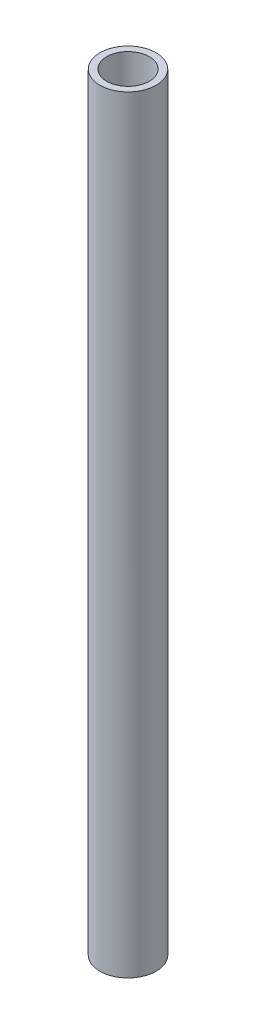
ISO-10303-21;
HEADER;
FILE_DESCRIPTION(('STEP AP214'),'2;1');
FILE_NAME('part.step','',(''),(''),'','','');
FILE_SCHEMA(('AUTOMOTIVE_DESIGN { 1 0 10303 214 1 1 1 1 }'));
ENDSEC;
DATA;
#1=APPLICATION_CONTEXT('core data for automotive mechanical design processes');
#2=APPLICATION_PROTOCOL_DEFINITION('international standard','automotive_design',2000,#1);
#3=PRODUCT_CONTEXT('',#1,'mechanical');
#4=PRODUCT('Part','Part','',(#3));
#5=PRODUCT_RELATED_PRODUCT_CATEGORY('part','',(#4));
#6=PRODUCT_DEFINITION_FORMATION('','',#4);
#7=PRODUCT_DEFINITION_CONTEXT('part definition',#1,'design');
#8=PRODUCT_DEFINITION('design','',#6,#7);
#9=PRODUCT_DEFINITION_SHAPE('','',#8);
#10=(LENGTH_UNIT() NAMED_UNIT(*) SI_UNIT(.MILLI.,.METRE.));
#11=(NAMED_UNIT(*) PLANE_ANGLE_UNIT() SI_UNIT($,.RADIAN.));
#12=(NAMED_UNIT(*) SI_UNIT($,.STERADIAN.) SOLID_ANGLE_UNIT());
#13=UNCERTAINTY_MEASURE_WITH_UNIT(LENGTH_MEASURE(1.E-05),#10,'distance_accuracy_value','');
#14=(GEOMETRIC_REPRESENTATION_CONTEXT(3) GLOBAL_UNCERTAINTY_ASSIGNED_CONTEXT((#13)) GLOBAL_UNIT_ASSIGNED_CONTEXT((#10,
#11,#12)) REPRESENTATION_CONTEXT('',''));
#15=CARTESIAN_POINT('',(0.,0.,0.));
#16=DIRECTION('',(0.,0.,1.));
#17=DIRECTION('',(1.,0.,0.));
#18=AXIS2_PLACEMENT_3D('',#15,#16,#17);
#19=CARTESIAN_POINT('',(0.,228.6,0.));
#20=DIRECTION('',(0.,1.,0.));
#21=DIRECTION('',(0.,0.,1.));
#22=AXIS2_PLACEMENT_3D('',#19,#20,#21);
#23=PLANE('',#22);
#24=CARTESIAN_POINT('',(0.,228.6,0.));
#25=DIRECTION('',(0.,1.,0.));
#26=DIRECTION('',(0.,0.,1.));
#27=AXIS2_PLACEMENT_3D('',#24,#25,#26);
#28=CIRCLE('',#27,8.382);
#29=CARTESIAN_POINT('',(0.,228.6,8.382));
#30=VERTEX_POINT('',#29);
#31=EDGE_CURVE('E128',#30,#30,#28,.T.);
#32=ORIENTED_EDGE('',*,*,#31,.T.);
#33=EDGE_LOOP('',(#32));
#34=FACE_BOUND('',#33,.T.);
#35=CARTESIAN_POINT('',(0.,228.6,0.));
#36=DIRECTION('',(0.,1.,0.));
#37=DIRECTION('',(0.,0.,1.));
#38=AXIS2_PLACEMENT_3D('',#35,#36,#37);
#39=CIRCLE('',#38,6.35);
#40=CARTESIAN_POINT('',(0.,228.6,6.35));
#41=VERTEX_POINT('',#40);
#42=EDGE_CURVE('E129',#41,#41,#39,.T.);
#43=ORIENTED_EDGE('',*,*,#42,.F.);
#44=EDGE_LOOP('',(#43));
#45=FACE_BOUND('',#44,.T.);
#46=ADVANCED_FACE('F33',(#34,#45),#23,.T.);
#47=CARTESIAN_POINT('',(0.,0.,0.));
#48=DIRECTION('',(0.,1.,0.));
#49=DIRECTION('',(0.,0.,1.));
#50=AXIS2_PLACEMENT_3D('',#47,#48,#49);
#51=PLANE('',#50);
#52=CARTESIAN_POINT('',(0.,0.,0.));
#53=DIRECTION('',(0.,1.,0.));
#54=DIRECTION('',(0.,0.,1.));
#55=AXIS2_PLACEMENT_3D('',#52,#53,#54);
#56=CIRCLE('',#55,8.382);
#57=CARTESIAN_POINT('',(-8.02575474401614,0.,2.41768169718481));
#58=VERTEX_POINT('',#57);
#59=CARTESIAN_POINT('',(-8.02575474401614,0.,-2.41768169718481));
#60=VERTEX_POINT('',#59);
#61=EDGE_CURVE('E91',#58,#60,#56,.T.);
#62=ORIENTED_EDGE('',*,*,#61,.F.);
#63=DIRECTION('',(1.,0.,0.));
#64=VECTOR('',#63,1.);
#65=CARTESIAN_POINT('',(0.,0.,2.41768169718481));
#66=LINE('',#65,#64);
#67=CARTESIAN_POINT('',(-5.87173868722864,0.,2.41768169718481));
#68=VERTEX_POINT('',#67);
#69=EDGE_CURVE('E56',#58,#68,#66,.T.);
#70=ORIENTED_EDGE('',*,*,#69,.T.);
#71=CARTESIAN_POINT('',(0.,0.,0.));
#72=DIRECTION('',(0.,1.,0.));
#73=DIRECTION('',(0.,0.,1.));
#74=AXIS2_PLACEMENT_3D('',#71,#72,#73);
#75=CIRCLE('',#74,6.35);
#76=CARTESIAN_POINT('',(-5.87173868722864,0.,-2.41768169718481));
#77=VERTEX_POINT('',#76);
#78=EDGE_CURVE('E133',#68,#77,#75,.T.);
#79=ORIENTED_EDGE('',*,*,#78,.T.);
#80=DIRECTION('',(-1.,0.,0.));
#81=VECTOR('',#80,1.);
#82=CARTESIAN_POINT('',(0.,0.,-2.41768169718481));
#83=LINE('',#82,#81);
#84=EDGE_CURVE('E49',#77,#60,#83,.T.);
#85=ORIENTED_EDGE('',*,*,#84,.T.);
#86=EDGE_LOOP('',(#62,#70,#79,#85));
#87=FACE_BOUND('',#86,.T.);
#88=ADVANCED_FACE('F118',(#87),#51,.F.);
#89=CARTESIAN_POINT('',(0.,228.6,0.));
#90=DIRECTION('',(0.,-1.,0.));
#91=DIRECTION('',(0.,0.,-1.));
#92=AXIS2_PLACEMENT_3D('',#89,#90,#91);
#93=CYLINDRICAL_SURFACE('',#92,8.382);
#94=ORIENTED_EDGE('',*,*,#31,.F.);
#95=EDGE_LOOP('',(#94));
#96=FACE_BOUND('',#95,.T.);
#97=CARTESIAN_POINT('',(-8.02575474401614,43.2806001451964,-2.41768169718481));
#98=CARTESIAN_POINT('',(-8.02574592323284,43.3470798083952,-2.41768984766419));
#99=CARTESIAN_POINT('',(-8.02658054814591,43.4135543433742,-2.41493983035563));
#100=CARTESIAN_POINT('',(-8.02987116821298,43.5459986445139,-2.40398684354942));
#101=CARTESIAN_POINT('',(-8.03232682189335,43.6119685140234,-2.3957850224849));
#102=CARTESIAN_POINT('',(-8.03878629280858,43.742780696534,-2.37401783381827));
#103=CARTESIAN_POINT('',(-8.04278639182017,43.8076253296954,-2.360465346092));
#104=CARTESIAN_POINT('',(-8.05220622643323,43.9358737954357,-2.3281281126403));
#105=CARTESIAN_POINT('',(-8.05762599471631,43.9992775948093,-2.30934324646182));
#106=CARTESIAN_POINT('',(-8.07578187146971,44.1866330918964,-2.24536454478365));
#107=CARTESIAN_POINT('',(-8.09042291943889,44.3078864743302,-2.19252010850181));
#108=CARTESIAN_POINT('',(-8.12312012350941,44.5398004688575,-2.06808055020635));
#109=CARTESIAN_POINT('',(-8.14117770260779,44.6504566381467,-1.99647761041398));
#110=CARTESIAN_POINT('',(-8.17926186247655,44.8613026041844,-1.83431242295396));
#111=CARTESIAN_POINT('',(-8.19932774261026,44.9611405177951,-1.74330099998006));
#112=CARTESIAN_POINT('',(-8.23883160422047,45.1443687137411,-1.54586504753086));
#113=CARTESIAN_POINT('',(-8.25826948076768,45.2277562592475,-1.43943795846807));
#114=CARTESIAN_POINT('',(-8.2947725759295,45.3772351788183,-1.2116936037931));
#115=CARTESIAN_POINT('',(-8.31178575880169,45.4429682294437,-1.09013206061911));
#116=CARTESIAN_POINT('',(-8.34106450247631,45.5529208848852,-0.837113174226223));
#117=CARTESIAN_POINT('',(-8.35333121507127,45.5971457096211,-0.705658241026869));
#118=CARTESIAN_POINT('',(-8.37145648152288,45.661667496991,-0.440284851412495));
#119=CARTESIAN_POINT('',(-8.37747658606831,45.6825687985,-0.30652456438821));
#120=CARTESIAN_POINT('',(-8.38299785833447,45.7017577347715,-0.0372666563195049));
#121=CARTESIAN_POINT('',(-8.38250015767284,45.7000492950241,0.0982306590620437));
#122=CARTESIAN_POINT('',(-8.37515733835851,45.6744792237348,0.362883085098166));
#123=CARTESIAN_POINT('',(-8.36849970246374,45.6512719029543,0.492107425730544));
#124=CARTESIAN_POINT('',(-8.34981064320936,45.5844277154504,0.744741469021638));
#125=CARTESIAN_POINT('',(-8.33777894645692,45.540789809363,0.868150875505971));
#126=CARTESIAN_POINT('',(-8.30942758427836,45.433859078801,1.10725105773894));
#127=CARTESIAN_POINT('',(-8.29306186194734,45.3703537268191,1.22284109995727));
#128=CARTESIAN_POINT('',(-8.25778878088219,45.2256576059106,1.44193637882153));
#129=CARTESIAN_POINT('',(-8.23888089634771,45.1444631761563,1.5454391071272));
#130=CARTESIAN_POINT('',(-8.1997603122373,44.9632814266678,1.74131983114535));
#131=CARTESIAN_POINT('',(-8.17952512634133,44.862727368211,1.83316973738955));
#132=CARTESIAN_POINT('',(-8.14062231139424,44.6474143463309,1.99886413922158));
#133=CARTESIAN_POINT('',(-8.12195513001716,44.5326513491573,2.07270350407786));
#134=CARTESIAN_POINT('',(-8.08819571166698,44.2908562556747,2.20078527244167));
#135=CARTESIAN_POINT('',(-8.07313634264108,44.1637251760985,2.25484970344676));
#136=CARTESIAN_POINT('',(-8.04870136900535,43.9017007066518,2.34058767430788));
#137=CARTESIAN_POINT('',(-8.03931713939087,43.7668194388132,2.37229520412993));
#138=CARTESIAN_POINT('',(-8.03084511715146,43.572348897312,2.4007309442148));
#139=CARTESIAN_POINT('',(-8.02894010973674,43.5141527978169,2.40708723209834));
#140=CARTESIAN_POINT('',(-8.02639494565468,43.3975141966335,2.41555854312273));
#141=CARTESIAN_POINT('',(-8.02575287196569,43.3390722035462,2.41767999444367));
#142=CARTESIAN_POINT('',(-8.02575474401614,43.2806001451964,2.41768169718481));
#143=B_SPLINE_CURVE_WITH_KNOTS('',3,(#97,#98,#99,#100,#101,#102,#103,#104,#105,#106,#107,#108,
#109,#110,#111,#112,#113,#114,#115,#116,#117,#118,#119,#120,#121,#122,#123,#124,#125,#126,#127,
#128,#129,#130,#131,#132,#133,#134,#135,#136,#137,#138,#139,#140,#141,#142),.UNSPECIFIED.,.F.,
.F.,(4,2,2,2,2,2,2,2,2,2,2,2,2,2,2,2,2,2,2,2,2,2,4),(0.,0.199368136928724,0.398694289873515,
0.597543531273081,0.796397350701106,1.19363097336179,1.59103041087575,1.9988833512217,
2.40680408847564,2.82246721200295,3.23802940613469,3.6425540269947,4.04700841545081,
4.43954403375382,4.83209962366758,5.22900700406487,5.62599660424046,6.03713778532502,
6.44839595333063,6.86326927903023,7.27751049053178,7.45309190839916,7.62840660290479),.UNSPECIFIED.);
#144=CARTESIAN_POINT('',(-8.02575474401615,43.2806001451964,-2.41768169718481));
#145=VERTEX_POINT('',#144);
#146=CARTESIAN_POINT('',(-8.02575474401614,43.2806001451964,2.41768169718481));
#147=VERTEX_POINT('',#146);
#148=EDGE_CURVE('E75',#145,#147,#143,.T.);
#149=ORIENTED_EDGE('',*,*,#148,.T.);
#150=DIRECTION('',(0.,-1.,0.));
#151=VECTOR('',#150,1.);
#152=CARTESIAN_POINT('',(-8.02575474401614,228.6,2.41768169718481));
#153=LINE('',#152,#151);
#154=EDGE_CURVE('E136',#147,#58,#153,.T.);
#155=ORIENTED_EDGE('',*,*,#154,.T.);
#156=ORIENTED_EDGE('',*,*,#61,.T.);
#157=DIRECTION('',(0.,-1.,0.));
#158=VECTOR('',#157,1.);
#159=CARTESIAN_POINT('',(-8.02575474401614,228.6,-2.41768169718481));
#160=LINE('',#159,#158);
#161=EDGE_CURVE('E84',#60,#145,#160,.F.);
#162=ORIENTED_EDGE('',*,*,#161,.T.);
#163=EDGE_LOOP('',(#149,#155,#156,#162));
#164=FACE_BOUND('',#163,.T.);
#165=ADVANCED_FACE('F35',(#96,#164),#93,.T.);
#166=CARTESIAN_POINT('',(0.,228.6,0.));
#167=DIRECTION('',(0.,-1.,0.));
#168=DIRECTION('',(0.,0.,-1.));
#169=AXIS2_PLACEMENT_3D('',#166,#167,#168);
#170=CYLINDRICAL_SURFACE('',#169,6.35);
#171=DIRECTION('',(0.,-1.,0.));
#172=VECTOR('',#171,1.);
#173=CARTESIAN_POINT('',(-5.87173868722864,228.6,2.41768169718481));
#174=LINE('',#173,#172);
#175=CARTESIAN_POINT('',(-5.87173868722864,43.2806001451964,2.41768169718481));
#176=VERTEX_POINT('',#175);
#177=EDGE_CURVE('E11',#176,#68,#174,.T.);
#178=ORIENTED_EDGE('',*,*,#177,.F.);
#179=CARTESIAN_POINT('',(-5.87173868722864,43.2806001451964,-2.41768169718481));
#180=CARTESIAN_POINT('',(-5.87172619344445,43.3459268296571,-2.41769105136478));
#181=CARTESIAN_POINT('',(-5.872828586096,43.4112466652434,-2.41503420813262));
#182=CARTESIAN_POINT('',(-5.87716989844634,43.5413658641289,-2.40446116207631));
#183=CARTESIAN_POINT('',(-5.88040807951585,43.6061653995269,-2.39654677748443));
#184=CARTESIAN_POINT('',(-5.88891238260009,43.7345496672297,-2.37556972498247));
#185=CARTESIAN_POINT('',(-5.89417110226387,43.7981379547799,-2.36252584520262));
#186=CARTESIAN_POINT('',(-5.90653892761936,43.9238794449506,-2.33143227081));
#187=CARTESIAN_POINT('',(-5.91364813156599,43.9860325711775,-2.31338231038667));
#188=CARTESIAN_POINT('',(-5.93742123578461,44.1695942555506,-2.25199341197326));
#189=CARTESIAN_POINT('',(-5.95654743772557,44.2883400664345,-2.20137651187181));
#190=CARTESIAN_POINT('',(-5.99918638121269,44.5156955758818,-2.08236353779838));
#191=CARTESIAN_POINT('',(-6.02270283849918,44.6242965705806,-2.01395238403425));
#192=CARTESIAN_POINT('',(-6.07281167057671,44.833838586978,-1.85755138397219));
#193=CARTESIAN_POINT('',(-6.09949610127272,44.9341910993857,-1.76880091534839));
#194=CARTESIAN_POINT('',(-6.15216743459183,45.1189998178981,-1.57585760558236));
#195=CARTESIAN_POINT('',(-6.17815419957731,45.2034529067898,-1.47166174338601));
#196=CARTESIAN_POINT('',(-6.22760787750758,45.3569571650737,-1.24625689850146));
#197=CARTESIAN_POINT('',(-6.25095364871422,45.4253603471775,-1.12457761371743));
#198=CARTESIAN_POINT('',(-6.29137799132811,45.5404763759846,-0.87039533462286));
#199=CARTESIAN_POINT('',(-6.30845896118978,45.5871975253896,-0.737896506334881));
#200=CARTESIAN_POINT('',(-6.33377300433249,45.6555377883814,-0.472065358104234));
#201=CARTESIAN_POINT('',(-6.34236470216331,45.6781777581481,-0.339030304921185));
#202=CARTESIAN_POINT('',(-6.35102133484782,45.7009876872174,-0.0707878619618855));
#203=CARTESIAN_POINT('',(-6.3510889813723,45.7011647924054,0.0644188232857493));
#204=CARTESIAN_POINT('',(-6.34291543997986,45.6796297722863,0.325832221324961));
#205=CARTESIAN_POINT('',(-6.33509762478401,45.6590330052197,0.452146376553918));
#206=CARTESIAN_POINT('',(-6.3125904992149,45.5984162176566,0.699367896206658));
#207=CARTESIAN_POINT('',(-6.29790079859748,45.558395094075,0.820274953142095));
#208=CARTESIAN_POINT('',(-6.26283072601581,45.4595658842565,1.05536546343567));
#209=CARTESIAN_POINT('',(-6.24236987287216,45.4004902690998,1.16942394791792));
#210=CARTESIAN_POINT('',(-6.19781899182077,45.2654680089295,1.38629532976313));
#211=CARTESIAN_POINT('',(-6.17372776131783,45.1895157694109,1.48910448113045));
#212=CARTESIAN_POINT('',(-6.12268271127711,45.0175687431317,1.68710799456216));
#213=CARTESIAN_POINT('',(-6.0956438666197,44.9206441746362,1.7814741560258));
#214=CARTESIAN_POINT('',(-6.0428945318585,44.712176787447,1.95294488950483));
#215=CARTESIAN_POINT('',(-6.01718458419133,44.6006280640663,2.03004245486711));
#216=CARTESIAN_POINT('',(-5.96944988423651,44.3626862916782,2.16645582652388));
#217=CARTESIAN_POINT('',(-5.94752839487035,44.2360012129752,2.22530042177909));
#218=CARTESIAN_POINT('',(-5.91106566024549,43.9735292890317,2.32043900041027));
#219=CARTESIAN_POINT('',(-5.89651188300459,43.8377583467525,2.35677129942907));
#220=CARTESIAN_POINT('',(-5.88175394003748,43.6306030376875,2.39324569679425));
#221=CARTESIAN_POINT('',(-5.87801335067304,43.5609458935954,2.40239986146384));
#222=CARTESIAN_POINT('',(-5.87300146596979,43.4210730558042,2.41461693504933));
#223=CARTESIAN_POINT('',(-5.87172803520543,43.3508578979998,2.41768511168886));
#224=CARTESIAN_POINT('',(-5.87173868722864,43.2806001451964,2.41768169718481));
#225=B_SPLINE_CURVE_WITH_KNOTS('',3,(#179,#180,#181,#182,#183,#184,#185,#186,#187,#188,#189,
#190,#191,#192,#193,#194,#195,#196,#197,#198,#199,#200,#201,#202,#203,#204,#205,#206,#207,#208,
#209,#210,#211,#212,#213,#214,#215,#216,#217,#218,#219,#220,#221,#222,#223,#224),.UNSPECIFIED.,
.F.,.F.,(4,2,2,2,2,2,2,2,2,2,2,2,2,2,2,2,2,2,2,2,2,2,4),(0.,0.19590529308727,0.391742870868607,
0.586869724719145,0.782006941309725,1.17157413936432,1.56147255904218,1.96944628016348,
2.37749990478342,2.79993993002318,3.22221805653303,3.62577866987913,4.02921090221774,
4.4120779013896,4.79496664564909,5.18348404433638,5.57213042698141,5.98411896615415,
6.39627436617363,6.81832227518771,7.23964987659275,7.45044493309518,7.66105745629702),.UNSPECIFIED.);
#226=CARTESIAN_POINT('',(-5.87173868722865,43.2806001451964,-2.41768169718481));
#227=VERTEX_POINT('',#226);
#228=EDGE_CURVE('E42',#227,#176,#225,.T.);
#229=ORIENTED_EDGE('',*,*,#228,.F.);
#230=DIRECTION('',(0.,-1.,0.));
#231=VECTOR('',#230,1.);
#232=CARTESIAN_POINT('',(-5.87173868722864,228.6,-2.41768169718481));
#233=LINE('',#232,#231);
#234=EDGE_CURVE('E87',#77,#227,#233,.F.);
#235=ORIENTED_EDGE('',*,*,#234,.F.);
#236=ORIENTED_EDGE('',*,*,#78,.F.);
#237=EDGE_LOOP('',(#178,#229,#235,#236));
#238=FACE_BOUND('',#237,.T.);
#239=ORIENTED_EDGE('',*,*,#42,.T.);
#240=EDGE_LOOP('',(#239));
#241=FACE_BOUND('',#240,.T.);
#242=ADVANCED_FACE('F112',(#238,#241),#170,.F.);
#243=CARTESIAN_POINT('',(-228.6,-8.09513591998065,2.41768169718481));
#244=DIRECTION('',(0.,0.,1.));
#245=DIRECTION('',(1.,0.,0.));
#246=AXIS2_PLACEMENT_3D('',#243,#244,#245);
#247=PLANE('',#246);
#248=DIRECTION('',(1.,0.,0.));
#249=VECTOR('',#248,1.);
#250=CARTESIAN_POINT('',(-228.6,43.2806001451964,2.41768169718481));
#251=LINE('',#250,#249);
#252=EDGE_CURVE('E81',#147,#176,#251,.T.);
#253=ORIENTED_EDGE('',*,*,#252,.T.);
#254=ORIENTED_EDGE('',*,*,#177,.T.);
#255=ORIENTED_EDGE('',*,*,#69,.F.);
#256=ORIENTED_EDGE('',*,*,#154,.F.);
#257=EDGE_LOOP('',(#253,#254,#255,#256));
#258=FACE_BOUND('',#257,.T.);
#259=ADVANCED_FACE('F104',(#258),#247,.F.);
#260=CARTESIAN_POINT('',(-228.6,43.2806001451964,0.));
#261=DIRECTION('',(1.,0.,0.));
#262=DIRECTION('',(0.,0.,-1.));
#263=AXIS2_PLACEMENT_3D('',#260,#261,#262);
#264=CYLINDRICAL_SURFACE('',#263,2.41768169718481);
#265=DIRECTION('',(1.,0.,0.));
#266=VECTOR('',#265,1.);
#267=CARTESIAN_POINT('',(-228.6,43.2806001451964,-2.41768169718481));
#268=LINE('',#267,#266);
#269=EDGE_CURVE('E78',#145,#227,#268,.T.);
#270=ORIENTED_EDGE('',*,*,#269,.T.);
#271=ORIENTED_EDGE('',*,*,#228,.T.);
#272=ORIENTED_EDGE('',*,*,#252,.F.);
#273=ORIENTED_EDGE('',*,*,#148,.F.);
#274=EDGE_LOOP('',(#270,#271,#272,#273));
#275=FACE_BOUND('',#274,.T.);
#276=ADVANCED_FACE('F77',(#275),#264,.F.);
#277=CARTESIAN_POINT('',(-228.6,-8.09513591998065,-2.41768169718481));
#278=DIRECTION('',(0.,0.,-1.));
#279=DIRECTION('',(-1.,0.,0.));
#280=AXIS2_PLACEMENT_3D('',#277,#278,#279);
#281=PLANE('',#280);
#282=ORIENTED_EDGE('',*,*,#84,.F.);
#283=ORIENTED_EDGE('',*,*,#234,.T.);
#284=ORIENTED_EDGE('',*,*,#269,.F.);
#285=ORIENTED_EDGE('',*,*,#161,.F.);
#286=EDGE_LOOP('',(#282,#283,#284,#285));
#287=FACE_BOUND('',#286,.T.);
#288=ADVANCED_FACE('F86',(#287),#281,.F.);
#289=CLOSED_SHELL('',(#46,#88,#165,#242,#259,#276,#288));
#290=MANIFOLD_SOLID_BREP('B2',#289);
#291=ADVANCED_BREP_SHAPE_REPRESENTATION('',(#18,#290),#14);
#292=SHAPE_DEFINITION_REPRESENTATION(#9,#291);
ENDSEC;
END-ISO-10303-21;
